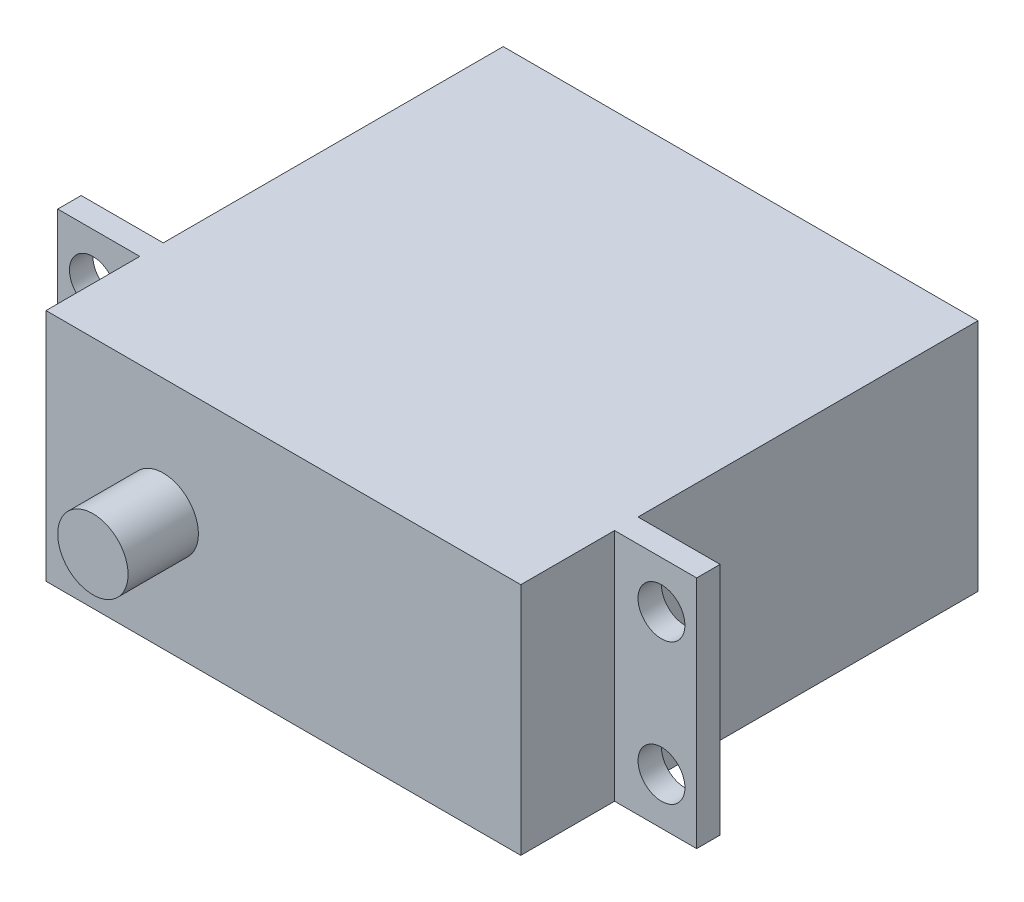
ISO-10303-21;
HEADER;
FILE_DESCRIPTION(('STEP AP214'),'2;1');
FILE_NAME('part.step','',(''),(''),'','','');
FILE_SCHEMA(('AUTOMOTIVE_DESIGN { 1 0 10303 214 1 1 1 1 }'));
ENDSEC;
DATA;
#1=APPLICATION_CONTEXT('core data for automotive mechanical design processes');
#2=APPLICATION_PROTOCOL_DEFINITION('international standard','automotive_design',2000,#1);
#3=PRODUCT_CONTEXT('',#1,'mechanical');
#4=PRODUCT('Part','Part','',(#3));
#5=PRODUCT_RELATED_PRODUCT_CATEGORY('part','',(#4));
#6=PRODUCT_DEFINITION_FORMATION('','',#4);
#7=PRODUCT_DEFINITION_CONTEXT('part definition',#1,'design');
#8=PRODUCT_DEFINITION('design','',#6,#7);
#9=PRODUCT_DEFINITION_SHAPE('','',#8);
#10=(LENGTH_UNIT() NAMED_UNIT(*) SI_UNIT(.MILLI.,.METRE.));
#11=(NAMED_UNIT(*) PLANE_ANGLE_UNIT() SI_UNIT($,.RADIAN.));
#12=(NAMED_UNIT(*) SI_UNIT($,.STERADIAN.) SOLID_ANGLE_UNIT());
#13=UNCERTAINTY_MEASURE_WITH_UNIT(LENGTH_MEASURE(1.E-05),#10,'distance_accuracy_value','');
#14=(GEOMETRIC_REPRESENTATION_CONTEXT(3) GLOBAL_UNCERTAINTY_ASSIGNED_CONTEXT((#13)) GLOBAL_UNIT_ASSIGNED_CONTEXT((#10,
#11,#12)) REPRESENTATION_CONTEXT('',''));
#15=CARTESIAN_POINT('',(0.,0.,0.));
#16=DIRECTION('',(0.,0.,1.));
#17=DIRECTION('',(1.,0.,0.));
#18=AXIS2_PLACEMENT_3D('',#15,#16,#17);
#19=CARTESIAN_POINT('',(20.25,10.,39.));
#20=DIRECTION('',(-1.,0.,0.));
#21=DIRECTION('',(0.,0.,1.));
#22=AXIS2_PLACEMENT_3D('',#19,#20,#21);
#23=PLANE('',#22);
#24=DIRECTION('',(0.,0.,-1.));
#25=VECTOR('',#24,1.);
#26=CARTESIAN_POINT('',(20.25,10.,39.));
#27=LINE('',#26,#25);
#28=CARTESIAN_POINT('',(20.25,10.,29.));
#29=VERTEX_POINT('',#28);
#30=CARTESIAN_POINT('',(20.25,10.,0.));
#31=VERTEX_POINT('',#30);
#32=EDGE_CURVE('E51',#29,#31,#27,.T.);
#33=ORIENTED_EDGE('',*,*,#32,.F.);
#34=DIRECTION('',(0.,-1.,0.));
#35=VECTOR('',#34,1.);
#36=CARTESIAN_POINT('',(20.25,10.,29.));
#37=LINE('',#36,#35);
#38=CARTESIAN_POINT('',(20.25,-10.,29.));
#39=VERTEX_POINT('',#38);
#40=EDGE_CURVE('E139',#29,#39,#37,.T.);
#41=ORIENTED_EDGE('',*,*,#40,.T.);
#42=DIRECTION('',(0.,0.,-1.));
#43=VECTOR('',#42,1.);
#44=CARTESIAN_POINT('',(20.25,-10.,39.));
#45=LINE('',#44,#43);
#46=CARTESIAN_POINT('',(20.25,-10.,0.));
#47=VERTEX_POINT('',#46);
#48=EDGE_CURVE('E223',#39,#47,#45,.T.);
#49=ORIENTED_EDGE('',*,*,#48,.T.);
#50=DIRECTION('',(0.,1.,0.));
#51=VECTOR('',#50,1.);
#52=CARTESIAN_POINT('',(20.25,10.,0.));
#53=LINE('',#52,#51);
#54=EDGE_CURVE('E210',#47,#31,#53,.T.);
#55=ORIENTED_EDGE('',*,*,#54,.T.);
#56=EDGE_LOOP('',(#33,#41,#49,#55));
#57=FACE_BOUND('',#56,.T.);
#58=ADVANCED_FACE('F43',(#57),#23,.F.);
#59=CARTESIAN_POINT('',(-20.25,10.,39.));
#60=DIRECTION('',(1.,0.,0.));
#61=DIRECTION('',(0.,1.,0.));
#62=AXIS2_PLACEMENT_3D('',#59,#60,#61);
#63=PLANE('',#62);
#64=DIRECTION('',(0.,-1.,0.));
#65=VECTOR('',#64,1.);
#66=CARTESIAN_POINT('',(-20.25,10.,29.));
#67=LINE('',#66,#65);
#68=CARTESIAN_POINT('',(-20.25,10.,29.));
#69=VERTEX_POINT('',#68);
#70=CARTESIAN_POINT('',(-20.25,-10.,29.));
#71=VERTEX_POINT('',#70);
#72=EDGE_CURVE('E66',#69,#71,#67,.T.);
#73=ORIENTED_EDGE('',*,*,#72,.F.);
#74=DIRECTION('',(0.,0.,-1.));
#75=VECTOR('',#74,1.);
#76=CARTESIAN_POINT('',(-20.25,10.,39.));
#77=LINE('',#76,#75);
#78=CARTESIAN_POINT('',(-20.25,10.,0.));
#79=VERTEX_POINT('',#78);
#80=EDGE_CURVE('E239',#69,#79,#77,.T.);
#81=ORIENTED_EDGE('',*,*,#80,.T.);
#82=DIRECTION('',(0.,-1.,0.));
#83=VECTOR('',#82,1.);
#84=CARTESIAN_POINT('',(-20.25,10.,0.));
#85=LINE('',#84,#83);
#86=CARTESIAN_POINT('',(-20.25,-10.,0.));
#87=VERTEX_POINT('',#86);
#88=EDGE_CURVE('E228',#79,#87,#85,.T.);
#89=ORIENTED_EDGE('',*,*,#88,.T.);
#90=DIRECTION('',(0.,0.,-1.));
#91=VECTOR('',#90,1.);
#92=CARTESIAN_POINT('',(-20.25,-10.,39.));
#93=LINE('',#92,#91);
#94=EDGE_CURVE('E236',#71,#87,#93,.T.);
#95=ORIENTED_EDGE('',*,*,#94,.F.);
#96=EDGE_LOOP('',(#73,#81,#89,#95));
#97=FACE_BOUND('',#96,.T.);
#98=ADVANCED_FACE('F244',(#97),#63,.F.);
#99=DIRECTION('',(0.,1.,0.));
#100=VECTOR('',#99,1.);
#101=CARTESIAN_POINT('',(-20.25,10.,31.));
#102=LINE('',#101,#100);
#103=CARTESIAN_POINT('',(-20.25,-10.,31.));
#104=VERTEX_POINT('',#103);
#105=CARTESIAN_POINT('',(-20.25,10.,31.));
#106=VERTEX_POINT('',#105);
#107=EDGE_CURVE('E185',#104,#106,#102,.T.);
#108=ORIENTED_EDGE('',*,*,#107,.F.);
#109=CARTESIAN_POINT('',(-20.25,-10.,39.));
#110=VERTEX_POINT('',#109);
#111=EDGE_CURVE('E237',#110,#104,#93,.T.);
#112=ORIENTED_EDGE('',*,*,#111,.F.);
#113=DIRECTION('',(0.,-1.,0.));
#114=VECTOR('',#113,1.);
#115=CARTESIAN_POINT('',(-20.25,10.,39.));
#116=LINE('',#115,#114);
#117=CARTESIAN_POINT('',(-20.25,10.,39.));
#118=VERTEX_POINT('',#117);
#119=EDGE_CURVE('E219',#118,#110,#116,.T.);
#120=ORIENTED_EDGE('',*,*,#119,.F.);
#121=EDGE_CURVE('E240',#118,#106,#77,.T.);
#122=ORIENTED_EDGE('',*,*,#121,.T.);
#123=EDGE_LOOP('',(#108,#112,#120,#122));
#124=FACE_BOUND('',#123,.T.);
#125=ADVANCED_FACE('F268',(#124),#63,.F.);
#126=CARTESIAN_POINT('',(20.25,-10.,39.));
#127=VERTEX_POINT('',#126);
#128=CARTESIAN_POINT('',(20.25,-10.,31.));
#129=VERTEX_POINT('',#128);
#130=EDGE_CURVE('E233',#127,#129,#45,.T.);
#131=ORIENTED_EDGE('',*,*,#130,.T.);
#132=DIRECTION('',(0.,1.,0.));
#133=VECTOR('',#132,1.);
#134=CARTESIAN_POINT('',(20.25,10.,31.));
#135=LINE('',#134,#133);
#136=CARTESIAN_POINT('',(20.25,10.,31.));
#137=VERTEX_POINT('',#136);
#138=EDGE_CURVE('E152',#129,#137,#135,.T.);
#139=ORIENTED_EDGE('',*,*,#138,.T.);
#140=CARTESIAN_POINT('',(20.25,10.,39.));
#141=VERTEX_POINT('',#140);
#142=EDGE_CURVE('E11',#141,#137,#27,.T.);
#143=ORIENTED_EDGE('',*,*,#142,.F.);
#144=DIRECTION('',(0.,1.,0.));
#145=VECTOR('',#144,1.);
#146=CARTESIAN_POINT('',(20.25,10.,39.));
#147=LINE('',#146,#145);
#148=EDGE_CURVE('E213',#127,#141,#147,.T.);
#149=ORIENTED_EDGE('',*,*,#148,.F.);
#150=EDGE_LOOP('',(#131,#139,#143,#149));
#151=FACE_BOUND('',#150,.T.);
#152=ADVANCED_FACE('F45',(#151),#23,.F.);
#153=CARTESIAN_POINT('',(-20.25,10.,39.));
#154=DIRECTION('',(0.,-1.,0.));
#155=DIRECTION('',(0.,0.,-1.));
#156=AXIS2_PLACEMENT_3D('',#153,#154,#155);
#157=PLANE('',#156);
#158=DIRECTION('',(-1.,0.,0.));
#159=VECTOR('',#158,1.);
#160=CARTESIAN_POINT('',(-20.25,10.,0.));
#161=LINE('',#160,#159);
#162=EDGE_CURVE('E226',#31,#79,#161,.T.);
#163=ORIENTED_EDGE('',*,*,#162,.T.);
#164=ORIENTED_EDGE('',*,*,#80,.F.);
#165=DIRECTION('',(1.,0.,0.));
#166=VECTOR('',#165,1.);
#167=CARTESIAN_POINT('',(-27.25,10.,29.));
#168=LINE('',#167,#166);
#169=CARTESIAN_POINT('',(-27.25,10.,29.));
#170=VERTEX_POINT('',#169);
#171=EDGE_CURVE('E191',#170,#69,#168,.T.);
#172=ORIENTED_EDGE('',*,*,#171,.F.);
#173=DIRECTION('',(0.,0.,-1.));
#174=VECTOR('',#173,1.);
#175=CARTESIAN_POINT('',(-27.25,10.,29.));
#176=LINE('',#175,#174);
#177=CARTESIAN_POINT('',(-27.25,10.,31.));
#178=VERTEX_POINT('',#177);
#179=EDGE_CURVE('E189',#178,#170,#176,.T.);
#180=ORIENTED_EDGE('',*,*,#179,.F.);
#181=DIRECTION('',(1.,0.,0.));
#182=VECTOR('',#181,1.);
#183=CARTESIAN_POINT('',(-27.25,10.,31.));
#184=LINE('',#183,#182);
#185=EDGE_CURVE('E197',#178,#106,#184,.T.);
#186=ORIENTED_EDGE('',*,*,#185,.T.);
#187=ORIENTED_EDGE('',*,*,#121,.F.);
#188=DIRECTION('',(-1.,0.,0.));
#189=VECTOR('',#188,1.);
#190=CARTESIAN_POINT('',(-20.25,10.,39.));
#191=LINE('',#190,#189);
#192=EDGE_CURVE('E216',#141,#118,#191,.T.);
#193=ORIENTED_EDGE('',*,*,#192,.F.);
#194=ORIENTED_EDGE('',*,*,#142,.T.);
#195=DIRECTION('',(-1.,0.,0.));
#196=VECTOR('',#195,1.);
#197=CARTESIAN_POINT('',(27.25,10.,31.));
#198=LINE('',#197,#196);
#199=CARTESIAN_POINT('',(27.25,10.,31.));
#200=VERTEX_POINT('',#199);
#201=EDGE_CURVE('E58',#200,#137,#198,.T.);
#202=ORIENTED_EDGE('',*,*,#201,.F.);
#203=DIRECTION('',(0.,0.,-1.));
#204=VECTOR('',#203,1.);
#205=CARTESIAN_POINT('',(27.25,10.,29.));
#206=LINE('',#205,#204);
#207=CARTESIAN_POINT('',(27.25,10.,29.));
#208=VERTEX_POINT('',#207);
#209=EDGE_CURVE('E149',#200,#208,#206,.T.);
#210=ORIENTED_EDGE('',*,*,#209,.T.);
#211=DIRECTION('',(-1.,0.,0.));
#212=VECTOR('',#211,1.);
#213=CARTESIAN_POINT('',(27.25,10.,29.));
#214=LINE('',#213,#212);
#215=EDGE_CURVE('E133',#208,#29,#214,.T.);
#216=ORIENTED_EDGE('',*,*,#215,.T.);
#217=ORIENTED_EDGE('',*,*,#32,.T.);
#218=EDGE_LOOP('',(#163,#164,#172,#180,#186,#187,#193,#194,#202,#210,#216,#217));
#219=FACE_BOUND('',#218,.T.);
#220=ADVANCED_FACE('F155',(#219),#157,.F.);
#221=CARTESIAN_POINT('',(-20.25,-10.,39.));
#222=DIRECTION('',(0.,1.,0.));
#223=DIRECTION('',(0.,0.,1.));
#224=AXIS2_PLACEMENT_3D('',#221,#222,#223);
#225=PLANE('',#224);
#226=DIRECTION('',(1.,0.,0.));
#227=VECTOR('',#226,1.);
#228=CARTESIAN_POINT('',(-20.25,-10.,0.));
#229=LINE('',#228,#227);
#230=EDGE_CURVE('E217',#87,#47,#229,.T.);
#231=ORIENTED_EDGE('',*,*,#230,.T.);
#232=ORIENTED_EDGE('',*,*,#48,.F.);
#233=DIRECTION('',(-1.,0.,0.));
#234=VECTOR('',#233,1.);
#235=CARTESIAN_POINT('',(27.25,-10.,29.));
#236=LINE('',#235,#234);
#237=CARTESIAN_POINT('',(27.25,-10.,29.));
#238=VERTEX_POINT('',#237);
#239=EDGE_CURVE('E162',#238,#39,#236,.T.);
#240=ORIENTED_EDGE('',*,*,#239,.F.);
#241=DIRECTION('',(0.,0.,1.));
#242=VECTOR('',#241,1.);
#243=CARTESIAN_POINT('',(27.25,-10.,29.));
#244=LINE('',#243,#242);
#245=CARTESIAN_POINT('',(27.25,-10.,31.));
#246=VERTEX_POINT('',#245);
#247=EDGE_CURVE('E151',#238,#246,#244,.T.);
#248=ORIENTED_EDGE('',*,*,#247,.T.);
#249=DIRECTION('',(-1.,0.,0.));
#250=VECTOR('',#249,1.);
#251=CARTESIAN_POINT('',(27.25,-10.,31.));
#252=LINE('',#251,#250);
#253=EDGE_CURVE('E167',#246,#129,#252,.T.);
#254=ORIENTED_EDGE('',*,*,#253,.T.);
#255=ORIENTED_EDGE('',*,*,#130,.F.);
#256=DIRECTION('',(1.,0.,0.));
#257=VECTOR('',#256,1.);
#258=CARTESIAN_POINT('',(-20.25,-10.,39.));
#259=LINE('',#258,#257);
#260=EDGE_CURVE('E221',#110,#127,#259,.T.);
#261=ORIENTED_EDGE('',*,*,#260,.F.);
#262=ORIENTED_EDGE('',*,*,#111,.T.);
#263=DIRECTION('',(1.,0.,0.));
#264=VECTOR('',#263,1.);
#265=CARTESIAN_POINT('',(-27.25,-10.,31.));
#266=LINE('',#265,#264);
#267=CARTESIAN_POINT('',(-27.25,-10.,31.));
#268=VERTEX_POINT('',#267);
#269=EDGE_CURVE('E200',#268,#104,#266,.T.);
#270=ORIENTED_EDGE('',*,*,#269,.F.);
#271=DIRECTION('',(0.,0.,1.));
#272=VECTOR('',#271,1.);
#273=CARTESIAN_POINT('',(-27.25,-10.,29.));
#274=LINE('',#273,#272);
#275=CARTESIAN_POINT('',(-27.25,-10.,29.));
#276=VERTEX_POINT('',#275);
#277=EDGE_CURVE('E184',#276,#268,#274,.T.);
#278=ORIENTED_EDGE('',*,*,#277,.F.);
#279=DIRECTION('',(1.,0.,0.));
#280=VECTOR('',#279,1.);
#281=CARTESIAN_POINT('',(-27.25,-10.,29.));
#282=LINE('',#281,#280);
#283=EDGE_CURVE('E203',#276,#71,#282,.T.);
#284=ORIENTED_EDGE('',*,*,#283,.T.);
#285=ORIENTED_EDGE('',*,*,#94,.T.);
#286=EDGE_LOOP('',(#231,#232,#240,#248,#254,#255,#261,#262,#270,#278,#284,#285));
#287=FACE_BOUND('',#286,.T.);
#288=ADVANCED_FACE('F254',(#287),#225,.F.);
#289=CARTESIAN_POINT('',(0.,0.,39.));
#290=DIRECTION('',(0.,0.,1.));
#291=DIRECTION('',(1.,0.,0.));
#292=AXIS2_PLACEMENT_3D('',#289,#290,#291);
#293=PLANE('',#292);
#294=CARTESIAN_POINT('',(-10.25,0.,39.));
#295=DIRECTION('',(0.,0.,1.));
#296=DIRECTION('',(1.,0.,0.));
#297=AXIS2_PLACEMENT_3D('',#294,#295,#296);
#298=CIRCLE('',#297,3.);
#299=CARTESIAN_POINT('',(-7.25,0.,39.));
#300=VERTEX_POINT('',#299);
#301=EDGE_CURVE('E206',#300,#300,#298,.T.);
#302=ORIENTED_EDGE('',*,*,#301,.F.);
#303=EDGE_LOOP('',(#302));
#304=FACE_BOUND('',#303,.T.);
#305=ORIENTED_EDGE('',*,*,#148,.T.);
#306=ORIENTED_EDGE('',*,*,#192,.T.);
#307=ORIENTED_EDGE('',*,*,#119,.T.);
#308=ORIENTED_EDGE('',*,*,#260,.T.);
#309=EDGE_LOOP('',(#305,#306,#307,#308));
#310=FACE_BOUND('',#309,.T.);
#311=ADVANCED_FACE('F273',(#304,#310),#293,.T.);
#312=CARTESIAN_POINT('',(0.,0.,0.));
#313=DIRECTION('',(0.,0.,1.));
#314=DIRECTION('',(1.,0.,0.));
#315=AXIS2_PLACEMENT_3D('',#312,#313,#314);
#316=PLANE('',#315);
#317=ORIENTED_EDGE('',*,*,#54,.F.);
#318=ORIENTED_EDGE('',*,*,#230,.F.);
#319=ORIENTED_EDGE('',*,*,#88,.F.);
#320=ORIENTED_EDGE('',*,*,#162,.F.);
#321=EDGE_LOOP('',(#317,#318,#319,#320));
#322=FACE_BOUND('',#321,.T.);
#323=ADVANCED_FACE('F251',(#322),#316,.F.);
#324=CARTESIAN_POINT('',(-10.25,0.,45.));
#325=DIRECTION('',(0.,0.,-1.));
#326=DIRECTION('',(-1.,0.,0.));
#327=AXIS2_PLACEMENT_3D('',#324,#325,#326);
#328=CYLINDRICAL_SURFACE('',#327,3.);
#329=CARTESIAN_POINT('',(-10.25,0.,45.));
#330=DIRECTION('',(0.,0.,1.));
#331=DIRECTION('',(1.,0.,0.));
#332=AXIS2_PLACEMENT_3D('',#329,#330,#331);
#333=CIRCLE('',#332,3.);
#334=CARTESIAN_POINT('',(-7.25,0.,45.));
#335=VERTEX_POINT('',#334);
#336=EDGE_CURVE('E207',#335,#335,#333,.T.);
#337=ORIENTED_EDGE('',*,*,#336,.F.);
#338=EDGE_LOOP('',(#337));
#339=FACE_BOUND('',#338,.T.);
#340=ORIENTED_EDGE('',*,*,#301,.T.);
#341=EDGE_LOOP('',(#340));
#342=FACE_BOUND('',#341,.T.);
#343=ADVANCED_FACE('F295',(#339,#342),#328,.T.);
#344=CARTESIAN_POINT('',(-10.25,0.,45.));
#345=DIRECTION('',(0.,0.,1.));
#346=DIRECTION('',(1.,0.,0.));
#347=AXIS2_PLACEMENT_3D('',#344,#345,#346);
#348=PLANE('',#347);
#349=ORIENTED_EDGE('',*,*,#336,.T.);
#350=EDGE_LOOP('',(#349));
#351=FACE_BOUND('',#350,.T.);
#352=ADVANCED_FACE('F301',(#351),#348,.T.);
#353=CARTESIAN_POINT('',(-27.25,10.,29.));
#354=DIRECTION('',(0.,0.,1.));
#355=DIRECTION('',(0.,-1.,0.));
#356=AXIS2_PLACEMENT_3D('',#353,#354,#355);
#357=PLANE('',#356);
#358=CARTESIAN_POINT('',(-24.25,6.,29.));
#359=DIRECTION('',(0.,0.,1.));
#360=DIRECTION('',(0.,-1.,0.));
#361=AXIS2_PLACEMENT_3D('',#358,#359,#360);
#362=CIRCLE('',#361,2.);
#363=CARTESIAN_POINT('',(-24.25,4.,29.));
#364=VERTEX_POINT('',#363);
#365=EDGE_CURVE('E178',#364,#364,#362,.T.);
#366=ORIENTED_EDGE('',*,*,#365,.T.);
#367=EDGE_LOOP('',(#366));
#368=FACE_BOUND('',#367,.T.);
#369=CARTESIAN_POINT('',(-24.25,-6.,29.));
#370=DIRECTION('',(0.,0.,1.));
#371=DIRECTION('',(0.,-1.,0.));
#372=AXIS2_PLACEMENT_3D('',#369,#370,#371);
#373=CIRCLE('',#372,2.);
#374=CARTESIAN_POINT('',(-24.25,-8.,29.));
#375=VERTEX_POINT('',#374);
#376=EDGE_CURVE('E173',#375,#375,#373,.T.);
#377=ORIENTED_EDGE('',*,*,#376,.T.);
#378=EDGE_LOOP('',(#377));
#379=FACE_BOUND('',#378,.T.);
#380=ORIENTED_EDGE('',*,*,#72,.T.);
#381=ORIENTED_EDGE('',*,*,#283,.F.);
#382=DIRECTION('',(0.,-1.,0.));
#383=VECTOR('',#382,1.);
#384=CARTESIAN_POINT('',(-27.25,10.,29.));
#385=LINE('',#384,#383);
#386=EDGE_CURVE('E181',#170,#276,#385,.T.);
#387=ORIENTED_EDGE('',*,*,#386,.F.);
#388=ORIENTED_EDGE('',*,*,#171,.T.);
#389=EDGE_LOOP('',(#380,#381,#387,#388));
#390=FACE_BOUND('',#389,.T.);
#391=ADVANCED_FACE('F259',(#368,#379,#390),#357,.F.);
#392=CARTESIAN_POINT('',(-27.25,10.,31.));
#393=DIRECTION('',(0.,0.,-1.));
#394=DIRECTION('',(-1.,0.,0.));
#395=AXIS2_PLACEMENT_3D('',#392,#393,#394);
#396=PLANE('',#395);
#397=CARTESIAN_POINT('',(-24.25,6.,31.));
#398=DIRECTION('',(0.,0.,1.));
#399=DIRECTION('',(1.,0.,0.));
#400=AXIS2_PLACEMENT_3D('',#397,#398,#399);
#401=CIRCLE('',#400,2.);
#402=CARTESIAN_POINT('',(-22.25,6.,31.));
#403=VERTEX_POINT('',#402);
#404=EDGE_CURVE('E170',#403,#403,#401,.T.);
#405=ORIENTED_EDGE('',*,*,#404,.F.);
#406=EDGE_LOOP('',(#405));
#407=FACE_BOUND('',#406,.T.);
#408=CARTESIAN_POINT('',(-24.25,-6.,31.));
#409=DIRECTION('',(0.,0.,1.));
#410=DIRECTION('',(-1.,0.,0.));
#411=AXIS2_PLACEMENT_3D('',#408,#409,#410);
#412=CIRCLE('',#411,2.);
#413=CARTESIAN_POINT('',(-26.25,-6.,31.));
#414=VERTEX_POINT('',#413);
#415=EDGE_CURVE('E143',#414,#414,#412,.T.);
#416=ORIENTED_EDGE('',*,*,#415,.F.);
#417=EDGE_LOOP('',(#416));
#418=FACE_BOUND('',#417,.T.);
#419=ORIENTED_EDGE('',*,*,#107,.T.);
#420=ORIENTED_EDGE('',*,*,#185,.F.);
#421=DIRECTION('',(0.,1.,0.));
#422=VECTOR('',#421,1.);
#423=CARTESIAN_POINT('',(-27.25,10.,31.));
#424=LINE('',#423,#422);
#425=EDGE_CURVE('E187',#268,#178,#424,.T.);
#426=ORIENTED_EDGE('',*,*,#425,.F.);
#427=ORIENTED_EDGE('',*,*,#269,.T.);
#428=EDGE_LOOP('',(#419,#420,#426,#427));
#429=FACE_BOUND('',#428,.T.);
#430=ADVANCED_FACE('F266',(#407,#418,#429),#396,.F.);
#431=CARTESIAN_POINT('',(-27.25,0.,0.));
#432=DIRECTION('',(-1.,0.,0.));
#433=DIRECTION('',(0.,-1.,0.));
#434=AXIS2_PLACEMENT_3D('',#431,#432,#433);
#435=PLANE('',#434);
#436=ORIENTED_EDGE('',*,*,#386,.T.);
#437=ORIENTED_EDGE('',*,*,#277,.T.);
#438=ORIENTED_EDGE('',*,*,#425,.T.);
#439=ORIENTED_EDGE('',*,*,#179,.T.);
#440=EDGE_LOOP('',(#436,#437,#438,#439));
#441=FACE_BOUND('',#440,.T.);
#442=ADVANCED_FACE('F263',(#441),#435,.T.);
#443=CARTESIAN_POINT('',(-24.25,-6.,24.));
#444=DIRECTION('',(0.,0.,1.));
#445=DIRECTION('',(1.,0.,0.));
#446=AXIS2_PLACEMENT_3D('',#443,#444,#445);
#447=CYLINDRICAL_SURFACE('',#446,2.);
#448=ORIENTED_EDGE('',*,*,#415,.T.);
#449=EDGE_LOOP('',(#448));
#450=FACE_BOUND('',#449,.T.);
#451=ORIENTED_EDGE('',*,*,#376,.F.);
#452=EDGE_LOOP('',(#451));
#453=FACE_BOUND('',#452,.T.);
#454=ADVANCED_FACE('F314',(#450,#453),#447,.F.);
#455=CARTESIAN_POINT('',(-24.25,6.,24.));
#456=DIRECTION('',(0.,0.,1.));
#457=DIRECTION('',(1.,0.,0.));
#458=AXIS2_PLACEMENT_3D('',#455,#456,#457);
#459=CYLINDRICAL_SURFACE('',#458,2.);
#460=ORIENTED_EDGE('',*,*,#404,.T.);
#461=EDGE_LOOP('',(#460));
#462=FACE_BOUND('',#461,.T.);
#463=ORIENTED_EDGE('',*,*,#365,.F.);
#464=EDGE_LOOP('',(#463));
#465=FACE_BOUND('',#464,.T.);
#466=ADVANCED_FACE('F317',(#462,#465),#459,.F.);
#467=CARTESIAN_POINT('',(27.25,10.,29.));
#468=DIRECTION('',(0.,0.,-1.));
#469=DIRECTION('',(0.,1.,0.));
#470=AXIS2_PLACEMENT_3D('',#467,#468,#469);
#471=PLANE('',#470);
#472=CARTESIAN_POINT('',(24.25,6.,29.));
#473=DIRECTION('',(0.,0.,-1.));
#474=DIRECTION('',(0.,1.,0.));
#475=AXIS2_PLACEMENT_3D('',#472,#473,#474);
#476=CIRCLE('',#475,2.);
#477=CARTESIAN_POINT('',(24.25,8.,29.));
#478=VERTEX_POINT('',#477);
#479=EDGE_CURVE('E164',#478,#478,#476,.F.);
#480=ORIENTED_EDGE('',*,*,#479,.T.);
#481=EDGE_LOOP('',(#480));
#482=FACE_BOUND('',#481,.T.);
#483=CARTESIAN_POINT('',(24.25,-6.,29.));
#484=DIRECTION('',(0.,0.,-1.));
#485=DIRECTION('',(0.,1.,0.));
#486=AXIS2_PLACEMENT_3D('',#483,#484,#485);
#487=CIRCLE('',#486,2.);
#488=CARTESIAN_POINT('',(24.25,-4.,29.));
#489=VERTEX_POINT('',#488);
#490=EDGE_CURVE('E345',#489,#489,#487,.F.);
#491=ORIENTED_EDGE('',*,*,#490,.T.);
#492=EDGE_LOOP('',(#491));
#493=FACE_BOUND('',#492,.T.);
#494=ORIENTED_EDGE('',*,*,#40,.F.);
#495=ORIENTED_EDGE('',*,*,#215,.F.);
#496=DIRECTION('',(0.,-1.,0.));
#497=VECTOR('',#496,1.);
#498=CARTESIAN_POINT('',(27.25,10.,29.));
#499=LINE('',#498,#497);
#500=EDGE_CURVE('E136',#208,#238,#499,.T.);
#501=ORIENTED_EDGE('',*,*,#500,.T.);
#502=ORIENTED_EDGE('',*,*,#239,.T.);
#503=EDGE_LOOP('',(#494,#495,#501,#502));
#504=FACE_BOUND('',#503,.T.);
#505=ADVANCED_FACE('F135',(#482,#493,#504),#471,.T.);
#506=CARTESIAN_POINT('',(27.25,10.,31.));
#507=DIRECTION('',(0.,0.,1.));
#508=DIRECTION('',(1.,0.,0.));
#509=AXIS2_PLACEMENT_3D('',#506,#507,#508);
#510=PLANE('',#509);
#511=CARTESIAN_POINT('',(24.25,6.,31.));
#512=DIRECTION('',(0.,0.,-1.));
#513=DIRECTION('',(-1.,0.,0.));
#514=AXIS2_PLACEMENT_3D('',#511,#512,#513);
#515=CIRCLE('',#514,2.);
#516=CARTESIAN_POINT('',(22.25,6.,31.));
#517=VERTEX_POINT('',#516);
#518=EDGE_CURVE('E344',#517,#517,#515,.T.);
#519=ORIENTED_EDGE('',*,*,#518,.T.);
#520=EDGE_LOOP('',(#519));
#521=FACE_BOUND('',#520,.T.);
#522=CARTESIAN_POINT('',(24.25,-6.,31.));
#523=DIRECTION('',(0.,0.,-1.));
#524=DIRECTION('',(1.,0.,0.));
#525=AXIS2_PLACEMENT_3D('',#522,#523,#524);
#526=CIRCLE('',#525,2.);
#527=CARTESIAN_POINT('',(26.25,-6.,31.));
#528=VERTEX_POINT('',#527);
#529=EDGE_CURVE('E346',#528,#528,#526,.T.);
#530=ORIENTED_EDGE('',*,*,#529,.T.);
#531=EDGE_LOOP('',(#530));
#532=FACE_BOUND('',#531,.T.);
#533=ORIENTED_EDGE('',*,*,#138,.F.);
#534=ORIENTED_EDGE('',*,*,#253,.F.);
#535=DIRECTION('',(0.,1.,0.));
#536=VECTOR('',#535,1.);
#537=CARTESIAN_POINT('',(27.25,10.,31.));
#538=LINE('',#537,#536);
#539=EDGE_CURVE('E156',#246,#200,#538,.T.);
#540=ORIENTED_EDGE('',*,*,#539,.T.);
#541=ORIENTED_EDGE('',*,*,#201,.T.);
#542=EDGE_LOOP('',(#533,#534,#540,#541));
#543=FACE_BOUND('',#542,.T.);
#544=ADVANCED_FACE('F276',(#521,#532,#543),#510,.T.);
#545=CARTESIAN_POINT('',(27.25,0.,0.));
#546=DIRECTION('',(1.,0.,0.));
#547=DIRECTION('',(0.,-1.,0.));
#548=AXIS2_PLACEMENT_3D('',#545,#546,#547);
#549=PLANE('',#548);
#550=ORIENTED_EDGE('',*,*,#500,.F.);
#551=ORIENTED_EDGE('',*,*,#209,.F.);
#552=ORIENTED_EDGE('',*,*,#539,.F.);
#553=ORIENTED_EDGE('',*,*,#247,.F.);
#554=EDGE_LOOP('',(#550,#551,#552,#553));
#555=FACE_BOUND('',#554,.T.);
#556=ADVANCED_FACE('F147',(#555),#549,.T.);
#557=CARTESIAN_POINT('',(24.25,-6.,24.));
#558=DIRECTION('',(0.,0.,1.));
#559=DIRECTION('',(1.,0.,0.));
#560=AXIS2_PLACEMENT_3D('',#557,#558,#559);
#561=CYLINDRICAL_SURFACE('',#560,2.);
#562=ORIENTED_EDGE('',*,*,#490,.F.);
#563=EDGE_LOOP('',(#562));
#564=FACE_BOUND('',#563,.T.);
#565=ORIENTED_EDGE('',*,*,#529,.F.);
#566=EDGE_LOOP('',(#565));
#567=FACE_BOUND('',#566,.T.);
#568=ADVANCED_FACE('F330',(#564,#567),#561,.F.);
#569=CARTESIAN_POINT('',(24.25,6.,24.));
#570=DIRECTION('',(0.,0.,1.));
#571=DIRECTION('',(1.,0.,0.));
#572=AXIS2_PLACEMENT_3D('',#569,#570,#571);
#573=CYLINDRICAL_SURFACE('',#572,2.);
#574=ORIENTED_EDGE('',*,*,#479,.F.);
#575=EDGE_LOOP('',(#574));
#576=FACE_BOUND('',#575,.T.);
#577=ORIENTED_EDGE('',*,*,#518,.F.);
#578=EDGE_LOOP('',(#577));
#579=FACE_BOUND('',#578,.T.);
#580=ADVANCED_FACE('F333',(#576,#579),#573,.F.);
#581=CLOSED_SHELL('',(#58,#98,#125,#152,#220,#288,#311,#323,#343,#352,#391,#430,#442,#454,#466,
#505,#544,#556,#568,#580));
#582=MANIFOLD_SOLID_BREP('B2',#581);
#583=ADVANCED_BREP_SHAPE_REPRESENTATION('',(#18,#582),#14);
#584=SHAPE_DEFINITION_REPRESENTATION(#9,#583);
ENDSEC;
END-ISO-10303-21;
